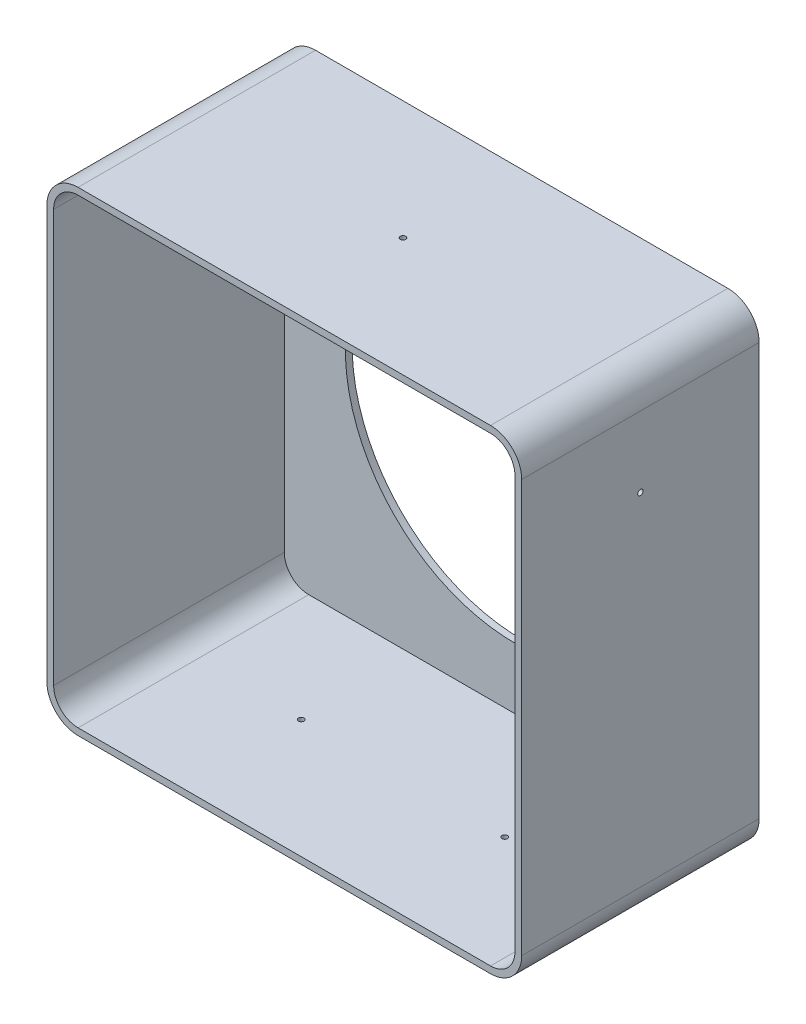
ISO-10303-21;
HEADER;
FILE_DESCRIPTION(('STEP AP214'),'2;1');
FILE_NAME('part.step','',(''),(''),'','','');
FILE_SCHEMA(('AUTOMOTIVE_DESIGN { 1 0 10303 214 1 1 1 1 }'));
ENDSEC;
DATA;
#1=APPLICATION_CONTEXT('core data for automotive mechanical design processes');
#2=APPLICATION_PROTOCOL_DEFINITION('international standard','automotive_design',2000,#1);
#3=PRODUCT_CONTEXT('',#1,'mechanical');
#4=PRODUCT('Part','Part','',(#3));
#5=PRODUCT_RELATED_PRODUCT_CATEGORY('part','',(#4));
#6=PRODUCT_DEFINITION_FORMATION('','',#4);
#7=PRODUCT_DEFINITION_CONTEXT('part definition',#1,'design');
#8=PRODUCT_DEFINITION('design','',#6,#7);
#9=PRODUCT_DEFINITION_SHAPE('','',#8);
#10=(LENGTH_UNIT() NAMED_UNIT(*) SI_UNIT(.MILLI.,.METRE.));
#11=(NAMED_UNIT(*) PLANE_ANGLE_UNIT() SI_UNIT($,.RADIAN.));
#12=(NAMED_UNIT(*) SI_UNIT($,.STERADIAN.) SOLID_ANGLE_UNIT());
#13=UNCERTAINTY_MEASURE_WITH_UNIT(LENGTH_MEASURE(1.E-05),#10,'distance_accuracy_value','');
#14=(GEOMETRIC_REPRESENTATION_CONTEXT(3) GLOBAL_UNCERTAINTY_ASSIGNED_CONTEXT((#13)) GLOBAL_UNIT_ASSIGNED_CONTEXT((#10,
#11,#12)) REPRESENTATION_CONTEXT('',''));
#15=CARTESIAN_POINT('',(0.,0.,0.));
#16=DIRECTION('',(0.,0.,1.));
#17=DIRECTION('',(1.,0.,0.));
#18=AXIS2_PLACEMENT_3D('',#15,#16,#17);
#19=CARTESIAN_POINT('',(0.,0.,35.));
#20=DIRECTION('',(0.,0.,-1.));
#21=DIRECTION('',(-1.,0.,0.));
#22=AXIS2_PLACEMENT_3D('',#19,#20,#21);
#23=CYLINDRICAL_SURFACE('',#22,25.);
#24=CARTESIAN_POINT('',(0.,0.,0.));
#25=DIRECTION('',(0.,0.,1.));
#26=DIRECTION('',(1.,0.,0.));
#27=AXIS2_PLACEMENT_3D('',#24,#25,#26);
#28=CIRCLE('',#27,25.);
#29=CARTESIAN_POINT('',(25.,0.,0.));
#30=VERTEX_POINT('',#29);
#31=EDGE_CURVE('E153',#30,#30,#28,.T.);
#32=ORIENTED_EDGE('',*,*,#31,.F.);
#33=EDGE_LOOP('',(#32));
#34=FACE_BOUND('',#33,.T.);
#35=CARTESIAN_POINT('',(0.,0.,1.));
#36=DIRECTION('',(0.,0.,1.));
#37=DIRECTION('',(1.,0.,0.));
#38=AXIS2_PLACEMENT_3D('',#35,#36,#37);
#39=CIRCLE('',#38,25.);
#40=CARTESIAN_POINT('',(25.,0.,1.));
#41=VERTEX_POINT('',#40);
#42=EDGE_CURVE('E177',#41,#41,#39,.T.);
#43=ORIENTED_EDGE('',*,*,#42,.T.);
#44=EDGE_LOOP('',(#43));
#45=FACE_BOUND('',#44,.T.);
#46=ADVANCED_FACE('F38',(#34,#45),#23,.F.);
#47=CARTESIAN_POINT('',(-30.39566950973,-30.39566950973,35.));
#48=DIRECTION('',(0.,0.,-1.));
#49=DIRECTION('',(-1.,0.,0.));
#50=AXIS2_PLACEMENT_3D('',#47,#48,#49);
#51=PLANE('',#50);
#52=CARTESIAN_POINT('',(-30.39566950973,-30.39566950973,35.));
#53=DIRECTION('',(0.,0.,1.));
#54=DIRECTION('',(1.,0.,0.));
#55=AXIS2_PLACEMENT_3D('',#52,#53,#54);
#56=CIRCLE('',#55,3.60433049026999);
#57=CARTESIAN_POINT('',(-34.,-30.39566950973,35.));
#58=VERTEX_POINT('',#57);
#59=CARTESIAN_POINT('',(-30.39566950973,-34.,35.));
#60=VERTEX_POINT('',#59);
#61=EDGE_CURVE('E239',#58,#60,#56,.T.);
#62=ORIENTED_EDGE('',*,*,#61,.F.);
#63=DIRECTION('',(0.,-1.,0.));
#64=VECTOR('',#63,1.);
#65=CARTESIAN_POINT('',(-34.,30.39566950973,35.));
#66=LINE('',#65,#64);
#67=CARTESIAN_POINT('',(-34.,30.39566950973,35.));
#68=VERTEX_POINT('',#67);
#69=EDGE_CURVE('E55',#68,#58,#66,.T.);
#70=ORIENTED_EDGE('',*,*,#69,.F.);
#71=CARTESIAN_POINT('',(-30.39566950973,30.39566950973,35.));
#72=DIRECTION('',(0.,0.,1.));
#73=DIRECTION('',(1.,0.,0.));
#74=AXIS2_PLACEMENT_3D('',#71,#72,#73);
#75=CIRCLE('',#74,3.60433049027);
#76=CARTESIAN_POINT('',(-30.39566950973,34.,35.));
#77=VERTEX_POINT('',#76);
#78=EDGE_CURVE('E216',#77,#68,#75,.T.);
#79=ORIENTED_EDGE('',*,*,#78,.F.);
#80=DIRECTION('',(-1.,0.,0.));
#81=VECTOR('',#80,1.);
#82=CARTESIAN_POINT('',(30.39566950973,34.,35.));
#83=LINE('',#82,#81);
#84=CARTESIAN_POINT('',(30.39566950973,34.,35.));
#85=VERTEX_POINT('',#84);
#86=EDGE_CURVE('E254',#85,#77,#83,.T.);
#87=ORIENTED_EDGE('',*,*,#86,.F.);
#88=CARTESIAN_POINT('',(30.39566950973,30.39566950973,35.));
#89=DIRECTION('',(0.,0.,1.));
#90=DIRECTION('',(1.,0.,0.));
#91=AXIS2_PLACEMENT_3D('',#88,#89,#90);
#92=CIRCLE('',#91,3.60433049027);
#93=CARTESIAN_POINT('',(34.,30.39566950973,35.));
#94=VERTEX_POINT('',#93);
#95=EDGE_CURVE('E251',#94,#85,#92,.T.);
#96=ORIENTED_EDGE('',*,*,#95,.F.);
#97=DIRECTION('',(0.,1.,0.));
#98=VECTOR('',#97,1.);
#99=CARTESIAN_POINT('',(34.,-30.39566950973,35.));
#100=LINE('',#99,#98);
#101=CARTESIAN_POINT('',(34.,-30.39566950973,35.));
#102=VERTEX_POINT('',#101);
#103=EDGE_CURVE('E248',#102,#94,#100,.T.);
#104=ORIENTED_EDGE('',*,*,#103,.F.);
#105=CARTESIAN_POINT('',(30.39566950973,-30.39566950973,35.));
#106=DIRECTION('',(0.,0.,1.));
#107=DIRECTION('',(1.,0.,0.));
#108=AXIS2_PLACEMENT_3D('',#105,#106,#107);
#109=CIRCLE('',#108,3.60433049026996);
#110=CARTESIAN_POINT('',(30.39566950973,-34.,35.));
#111=VERTEX_POINT('',#110);
#112=EDGE_CURVE('E245',#111,#102,#109,.T.);
#113=ORIENTED_EDGE('',*,*,#112,.F.);
#114=DIRECTION('',(1.,0.,0.));
#115=VECTOR('',#114,1.);
#116=CARTESIAN_POINT('',(-30.39566950973,-34.,35.));
#117=LINE('',#116,#115);
#118=EDGE_CURVE('E242',#60,#111,#117,.T.);
#119=ORIENTED_EDGE('',*,*,#118,.F.);
#120=EDGE_LOOP('',(#62,#70,#79,#87,#96,#104,#113,#119));
#121=FACE_BOUND('',#120,.T.);
#122=CARTESIAN_POINT('',(-30.39566950973,-30.39566950973,35.));
#123=DIRECTION('',(0.,0.,1.));
#124=DIRECTION('',(-1.,0.,0.));
#125=AXIS2_PLACEMENT_3D('',#122,#123,#124);
#126=CIRCLE('',#125,4.60433049026999);
#127=CARTESIAN_POINT('',(-35.,-30.39566950973,35.));
#128=VERTEX_POINT('',#127);
#129=CARTESIAN_POINT('',(-30.39566950973,-35.,35.));
#130=VERTEX_POINT('',#129);
#131=EDGE_CURVE('E165',#128,#130,#126,.T.);
#132=ORIENTED_EDGE('',*,*,#131,.T.);
#133=DIRECTION('',(1.,0.,0.));
#134=VECTOR('',#133,1.);
#135=CARTESIAN_POINT('',(-30.39566950973,-35.,35.));
#136=LINE('',#135,#134);
#137=CARTESIAN_POINT('',(30.39566950973,-35.,35.));
#138=VERTEX_POINT('',#137);
#139=EDGE_CURVE('E105',#130,#138,#136,.T.);
#140=ORIENTED_EDGE('',*,*,#139,.T.);
#141=CARTESIAN_POINT('',(30.39566950973,-30.39566950973,35.));
#142=DIRECTION('',(0.,0.,1.));
#143=DIRECTION('',(-1.,0.,0.));
#144=AXIS2_PLACEMENT_3D('',#141,#142,#143);
#145=CIRCLE('',#144,4.60433049026999);
#146=CARTESIAN_POINT('',(35.,-30.39566950973,35.));
#147=VERTEX_POINT('',#146);
#148=EDGE_CURVE('E283',#138,#147,#145,.T.);
#149=ORIENTED_EDGE('',*,*,#148,.T.);
#150=DIRECTION('',(0.,1.,0.));
#151=VECTOR('',#150,1.);
#152=CARTESIAN_POINT('',(35.,30.39566950973,35.));
#153=LINE('',#152,#151);
#154=CARTESIAN_POINT('',(35.,30.39566950973,35.));
#155=VERTEX_POINT('',#154);
#156=EDGE_CURVE('E285',#147,#155,#153,.T.);
#157=ORIENTED_EDGE('',*,*,#156,.T.);
#158=CARTESIAN_POINT('',(30.39566950973,30.39566950973,35.));
#159=DIRECTION('',(0.,0.,1.));
#160=DIRECTION('',(1.,0.,0.));
#161=AXIS2_PLACEMENT_3D('',#158,#159,#160);
#162=CIRCLE('',#161,4.60433049026998);
#163=CARTESIAN_POINT('',(30.39566950973,35.,35.));
#164=VERTEX_POINT('',#163);
#165=EDGE_CURVE('E128',#155,#164,#162,.T.);
#166=ORIENTED_EDGE('',*,*,#165,.T.);
#167=DIRECTION('',(-1.,0.,0.));
#168=VECTOR('',#167,1.);
#169=CARTESIAN_POINT('',(-30.39566950973,35.,35.));
#170=LINE('',#169,#168);
#171=CARTESIAN_POINT('',(-30.39566950973,35.,35.));
#172=VERTEX_POINT('',#171);
#173=EDGE_CURVE('E121',#164,#172,#170,.T.);
#174=ORIENTED_EDGE('',*,*,#173,.T.);
#175=CARTESIAN_POINT('',(-30.39566950973,30.39566950973,35.));
#176=DIRECTION('',(0.,0.,1.));
#177=DIRECTION('',(1.,0.,0.));
#178=AXIS2_PLACEMENT_3D('',#175,#176,#177);
#179=CIRCLE('',#178,4.60433049027);
#180=CARTESIAN_POINT('',(-35.,30.39566950973,35.));
#181=VERTEX_POINT('',#180);
#182=EDGE_CURVE('E125',#172,#181,#179,.T.);
#183=ORIENTED_EDGE('',*,*,#182,.T.);
#184=DIRECTION('',(0.,-1.,0.));
#185=VECTOR('',#184,1.);
#186=CARTESIAN_POINT('',(-35.,30.39566950973,35.));
#187=LINE('',#186,#185);
#188=EDGE_CURVE('E64',#181,#128,#187,.T.);
#189=ORIENTED_EDGE('',*,*,#188,.T.);
#190=EDGE_LOOP('',(#132,#140,#149,#157,#166,#174,#183,#189));
#191=FACE_BOUND('',#190,.T.);
#192=ADVANCED_FACE('F123',(#121,#191),#51,.F.);
#193=CARTESIAN_POINT('',(-30.39566950973,-30.39566950973,0.));
#194=DIRECTION('',(0.,0.,-1.));
#195=DIRECTION('',(-1.,0.,0.));
#196=AXIS2_PLACEMENT_3D('',#193,#194,#195);
#197=PLANE('',#196);
#198=CARTESIAN_POINT('',(-30.39566950973,-30.39566950973,0.));
#199=DIRECTION('',(0.,0.,1.));
#200=DIRECTION('',(-1.,0.,0.));
#201=AXIS2_PLACEMENT_3D('',#198,#199,#200);
#202=CIRCLE('',#201,4.60433049026999);
#203=CARTESIAN_POINT('',(-35.,-30.39566950973,0.));
#204=VERTEX_POINT('',#203);
#205=CARTESIAN_POINT('',(-30.39566950973,-35.,0.));
#206=VERTEX_POINT('',#205);
#207=EDGE_CURVE('E149',#204,#206,#202,.T.);
#208=ORIENTED_EDGE('',*,*,#207,.F.);
#209=DIRECTION('',(0.,-1.,0.));
#210=VECTOR('',#209,1.);
#211=CARTESIAN_POINT('',(-35.,30.39566950973,0.));
#212=LINE('',#211,#210);
#213=CARTESIAN_POINT('',(-35.,30.39566950973,0.));
#214=VERTEX_POINT('',#213);
#215=EDGE_CURVE('E97',#214,#204,#212,.T.);
#216=ORIENTED_EDGE('',*,*,#215,.F.);
#217=CARTESIAN_POINT('',(-30.39566950973,30.39566950973,0.));
#218=DIRECTION('',(0.,0.,1.));
#219=DIRECTION('',(1.,0.,0.));
#220=AXIS2_PLACEMENT_3D('',#217,#218,#219);
#221=CIRCLE('',#220,4.60433049027);
#222=CARTESIAN_POINT('',(-30.39566950973,35.,0.));
#223=VERTEX_POINT('',#222);
#224=EDGE_CURVE('E162',#223,#214,#221,.T.);
#225=ORIENTED_EDGE('',*,*,#224,.F.);
#226=DIRECTION('',(-1.,0.,0.));
#227=VECTOR('',#226,1.);
#228=CARTESIAN_POINT('',(-30.39566950973,35.,0.));
#229=LINE('',#228,#227);
#230=CARTESIAN_POINT('',(30.39566950973,35.,0.));
#231=VERTEX_POINT('',#230);
#232=EDGE_CURVE('E137',#231,#223,#229,.T.);
#233=ORIENTED_EDGE('',*,*,#232,.F.);
#234=CARTESIAN_POINT('',(30.39566950973,30.39566950973,0.));
#235=DIRECTION('',(0.,0.,1.));
#236=DIRECTION('',(1.,0.,0.));
#237=AXIS2_PLACEMENT_3D('',#234,#235,#236);
#238=CIRCLE('',#237,4.60433049026998);
#239=CARTESIAN_POINT('',(35.,30.39566950973,0.));
#240=VERTEX_POINT('',#239);
#241=EDGE_CURVE('E159',#240,#231,#238,.T.);
#242=ORIENTED_EDGE('',*,*,#241,.F.);
#243=DIRECTION('',(0.,1.,0.));
#244=VECTOR('',#243,1.);
#245=CARTESIAN_POINT('',(35.,30.39566950973,0.));
#246=LINE('',#245,#244);
#247=CARTESIAN_POINT('',(35.,-30.39566950973,0.));
#248=VERTEX_POINT('',#247);
#249=EDGE_CURVE('E157',#248,#240,#246,.T.);
#250=ORIENTED_EDGE('',*,*,#249,.F.);
#251=CARTESIAN_POINT('',(30.39566950973,-30.39566950973,0.));
#252=DIRECTION('',(0.,0.,1.));
#253=DIRECTION('',(-1.,0.,0.));
#254=AXIS2_PLACEMENT_3D('',#251,#252,#253);
#255=CIRCLE('',#254,4.60433049026999);
#256=CARTESIAN_POINT('',(30.39566950973,-35.,0.));
#257=VERTEX_POINT('',#256);
#258=EDGE_CURVE('E155',#257,#248,#255,.T.);
#259=ORIENTED_EDGE('',*,*,#258,.F.);
#260=DIRECTION('',(1.,0.,0.));
#261=VECTOR('',#260,1.);
#262=CARTESIAN_POINT('',(-30.39566950973,-35.,0.));
#263=LINE('',#262,#261);
#264=EDGE_CURVE('E152',#206,#257,#263,.T.);
#265=ORIENTED_EDGE('',*,*,#264,.F.);
#266=EDGE_LOOP('',(#208,#216,#225,#233,#242,#250,#259,#265));
#267=FACE_BOUND('',#266,.T.);
#268=ORIENTED_EDGE('',*,*,#31,.T.);
#269=EDGE_LOOP('',(#268));
#270=FACE_BOUND('',#269,.T.);
#271=ADVANCED_FACE('F298',(#267,#270),#197,.T.);
#272=CARTESIAN_POINT('',(-30.39566950973,-30.39566950973,35.));
#273=DIRECTION('',(0.,0.,-1.));
#274=DIRECTION('',(-1.,0.,0.));
#275=AXIS2_PLACEMENT_3D('',#272,#273,#274);
#276=CYLINDRICAL_SURFACE('',#275,4.60433049026999);
#277=ORIENTED_EDGE('',*,*,#207,.T.);
#278=DIRECTION('',(0.,0.,-1.));
#279=VECTOR('',#278,1.);
#280=CARTESIAN_POINT('',(-30.39566950973,-35.,35.));
#281=LINE('',#280,#279);
#282=EDGE_CURVE('E11',#130,#206,#281,.T.);
#283=ORIENTED_EDGE('',*,*,#282,.F.);
#284=ORIENTED_EDGE('',*,*,#131,.F.);
#285=DIRECTION('',(0.,0.,-1.));
#286=VECTOR('',#285,1.);
#287=CARTESIAN_POINT('',(-35.,-30.39566950973,35.));
#288=LINE('',#287,#286);
#289=EDGE_CURVE('E145',#128,#204,#288,.T.);
#290=ORIENTED_EDGE('',*,*,#289,.T.);
#291=EDGE_LOOP('',(#277,#283,#284,#290));
#292=FACE_BOUND('',#291,.T.);
#293=ADVANCED_FACE('F40',(#292),#276,.T.);
#294=CARTESIAN_POINT('',(-30.39566950973,-35.,35.));
#295=DIRECTION('',(0.,1.,0.));
#296=DIRECTION('',(0.,0.,1.));
#297=AXIS2_PLACEMENT_3D('',#294,#295,#296);
#298=PLANE('',#297);
#299=CARTESIAN_POINT('',(-15.,-35.,17.5));
#300=DIRECTION('',(0.,-1.,0.));
#301=DIRECTION('',(0.,0.,-1.));
#302=AXIS2_PLACEMENT_3D('',#299,#300,#301);
#303=CIRCLE('',#302,0.4);
#304=CARTESIAN_POINT('',(-15.,-35.,17.1));
#305=VERTEX_POINT('',#304);
#306=EDGE_CURVE('E191',#305,#305,#303,.T.);
#307=ORIENTED_EDGE('',*,*,#306,.F.);
#308=EDGE_LOOP('',(#307));
#309=FACE_BOUND('',#308,.T.);
#310=CARTESIAN_POINT('',(15.,-35.,17.5));
#311=DIRECTION('',(0.,-1.,0.));
#312=DIRECTION('',(0.,0.,-1.));
#313=AXIS2_PLACEMENT_3D('',#310,#311,#312);
#314=CIRCLE('',#313,0.4);
#315=CARTESIAN_POINT('',(15.,-35.,17.1));
#316=VERTEX_POINT('',#315);
#317=EDGE_CURVE('E196',#316,#316,#314,.T.);
#318=ORIENTED_EDGE('',*,*,#317,.F.);
#319=EDGE_LOOP('',(#318));
#320=FACE_BOUND('',#319,.T.);
#321=ORIENTED_EDGE('',*,*,#264,.T.);
#322=DIRECTION('',(0.,0.,-1.));
#323=VECTOR('',#322,1.);
#324=CARTESIAN_POINT('',(30.39566950973,-35.,35.));
#325=LINE('',#324,#323);
#326=EDGE_CURVE('E47',#138,#257,#325,.T.);
#327=ORIENTED_EDGE('',*,*,#326,.F.);
#328=ORIENTED_EDGE('',*,*,#139,.F.);
#329=ORIENTED_EDGE('',*,*,#282,.T.);
#330=EDGE_LOOP('',(#321,#327,#328,#329));
#331=FACE_BOUND('',#330,.T.);
#332=ADVANCED_FACE('F304',(#309,#320,#331),#298,.F.);
#333=CARTESIAN_POINT('',(30.39566950973,-30.39566950973,35.));
#334=DIRECTION('',(0.,0.,-1.));
#335=DIRECTION('',(-1.,0.,0.));
#336=AXIS2_PLACEMENT_3D('',#333,#334,#335);
#337=CYLINDRICAL_SURFACE('',#336,4.60433049026999);
#338=ORIENTED_EDGE('',*,*,#258,.T.);
#339=DIRECTION('',(0.,0.,-1.));
#340=VECTOR('',#339,1.);
#341=CARTESIAN_POINT('',(35.,-30.39566950973,35.));
#342=LINE('',#341,#340);
#343=EDGE_CURVE('E172',#147,#248,#342,.T.);
#344=ORIENTED_EDGE('',*,*,#343,.F.);
#345=ORIENTED_EDGE('',*,*,#148,.F.);
#346=ORIENTED_EDGE('',*,*,#326,.T.);
#347=EDGE_LOOP('',(#338,#344,#345,#346));
#348=FACE_BOUND('',#347,.T.);
#349=ADVANCED_FACE('F307',(#348),#337,.T.);
#350=CARTESIAN_POINT('',(35.,30.39566950973,35.));
#351=DIRECTION('',(-1.,0.,0.));
#352=DIRECTION('',(0.,-1.,0.));
#353=AXIS2_PLACEMENT_3D('',#350,#351,#352);
#354=PLANE('',#353);
#355=CARTESIAN_POINT('',(35.,20.,17.5));
#356=DIRECTION('',(1.,0.,0.));
#357=DIRECTION('',(0.,1.,0.));
#358=AXIS2_PLACEMENT_3D('',#355,#356,#357);
#359=CIRCLE('',#358,0.400000000000002);
#360=CARTESIAN_POINT('',(35.,20.4,17.5));
#361=VERTEX_POINT('',#360);
#362=EDGE_CURVE('E185',#361,#361,#359,.T.);
#363=ORIENTED_EDGE('',*,*,#362,.F.);
#364=EDGE_LOOP('',(#363));
#365=FACE_BOUND('',#364,.T.);
#366=ORIENTED_EDGE('',*,*,#249,.T.);
#367=DIRECTION('',(0.,0.,-1.));
#368=VECTOR('',#367,1.);
#369=CARTESIAN_POINT('',(35.,30.39566950973,35.));
#370=LINE('',#369,#368);
#371=EDGE_CURVE('E169',#155,#240,#370,.T.);
#372=ORIENTED_EDGE('',*,*,#371,.F.);
#373=ORIENTED_EDGE('',*,*,#156,.F.);
#374=ORIENTED_EDGE('',*,*,#343,.T.);
#375=EDGE_LOOP('',(#366,#372,#373,#374));
#376=FACE_BOUND('',#375,.T.);
#377=ADVANCED_FACE('F291',(#365,#376),#354,.F.);
#378=CARTESIAN_POINT('',(30.39566950973,30.39566950973,35.));
#379=DIRECTION('',(0.,0.,-1.));
#380=DIRECTION('',(-1.,0.,0.));
#381=AXIS2_PLACEMENT_3D('',#378,#379,#380);
#382=CYLINDRICAL_SURFACE('',#381,4.60433049026998);
#383=ORIENTED_EDGE('',*,*,#241,.T.);
#384=DIRECTION('',(0.,0.,-1.));
#385=VECTOR('',#384,1.);
#386=CARTESIAN_POINT('',(30.39566950973,35.,35.));
#387=LINE('',#386,#385);
#388=EDGE_CURVE('E140',#164,#231,#387,.T.);
#389=ORIENTED_EDGE('',*,*,#388,.F.);
#390=ORIENTED_EDGE('',*,*,#165,.F.);
#391=ORIENTED_EDGE('',*,*,#371,.T.);
#392=EDGE_LOOP('',(#383,#389,#390,#391));
#393=FACE_BOUND('',#392,.T.);
#394=ADVANCED_FACE('F295',(#393),#382,.T.);
#395=CARTESIAN_POINT('',(-30.39566950973,35.,35.));
#396=DIRECTION('',(0.,-1.,0.));
#397=DIRECTION('',(0.,0.,-1.));
#398=AXIS2_PLACEMENT_3D('',#395,#396,#397);
#399=PLANE('',#398);
#400=CARTESIAN_POINT('',(0.,35.,17.5));
#401=DIRECTION('',(0.,1.,0.));
#402=DIRECTION('',(0.,0.,1.));
#403=AXIS2_PLACEMENT_3D('',#400,#401,#402);
#404=CIRCLE('',#403,0.4);
#405=CARTESIAN_POINT('',(0.,35.,17.9));
#406=VERTEX_POINT('',#405);
#407=EDGE_CURVE('E188',#406,#406,#404,.T.);
#408=ORIENTED_EDGE('',*,*,#407,.F.);
#409=EDGE_LOOP('',(#408));
#410=FACE_BOUND('',#409,.T.);
#411=ORIENTED_EDGE('',*,*,#232,.T.);
#412=DIRECTION('',(0.,0.,-1.));
#413=VECTOR('',#412,1.);
#414=CARTESIAN_POINT('',(-30.39566950973,35.,35.));
#415=LINE('',#414,#413);
#416=EDGE_CURVE('E134',#172,#223,#415,.T.);
#417=ORIENTED_EDGE('',*,*,#416,.F.);
#418=ORIENTED_EDGE('',*,*,#173,.F.);
#419=ORIENTED_EDGE('',*,*,#388,.T.);
#420=EDGE_LOOP('',(#411,#417,#418,#419));
#421=FACE_BOUND('',#420,.T.);
#422=ADVANCED_FACE('F135',(#410,#421),#399,.F.);
#423=CARTESIAN_POINT('',(-30.39566950973,30.39566950973,35.));
#424=DIRECTION('',(0.,0.,-1.));
#425=DIRECTION('',(-1.,0.,0.));
#426=AXIS2_PLACEMENT_3D('',#423,#424,#425);
#427=CYLINDRICAL_SURFACE('',#426,4.60433049027);
#428=ORIENTED_EDGE('',*,*,#224,.T.);
#429=DIRECTION('',(0.,0.,-1.));
#430=VECTOR('',#429,1.);
#431=CARTESIAN_POINT('',(-35.,30.39566950973,35.));
#432=LINE('',#431,#430);
#433=EDGE_CURVE('E141',#181,#214,#432,.T.);
#434=ORIENTED_EDGE('',*,*,#433,.F.);
#435=ORIENTED_EDGE('',*,*,#182,.F.);
#436=ORIENTED_EDGE('',*,*,#416,.T.);
#437=EDGE_LOOP('',(#428,#434,#435,#436));
#438=FACE_BOUND('',#437,.T.);
#439=ADVANCED_FACE('F143',(#438),#427,.T.);
#440=CARTESIAN_POINT('',(-35.,30.39566950973,35.));
#441=DIRECTION('',(1.,0.,0.));
#442=DIRECTION('',(0.,1.,0.));
#443=AXIS2_PLACEMENT_3D('',#440,#441,#442);
#444=PLANE('',#443);
#445=CARTESIAN_POINT('',(-35.,20.,17.5));
#446=DIRECTION('',(1.,0.,0.));
#447=DIRECTION('',(0.,1.,0.));
#448=AXIS2_PLACEMENT_3D('',#445,#446,#447);
#449=CIRCLE('',#448,0.400000000000002);
#450=CARTESIAN_POINT('',(-35.,20.4,17.5));
#451=VERTEX_POINT('',#450);
#452=EDGE_CURVE('E209',#451,#451,#449,.T.);
#453=ORIENTED_EDGE('',*,*,#452,.T.);
#454=EDGE_LOOP('',(#453));
#455=FACE_BOUND('',#454,.T.);
#456=ORIENTED_EDGE('',*,*,#215,.T.);
#457=ORIENTED_EDGE('',*,*,#289,.F.);
#458=ORIENTED_EDGE('',*,*,#188,.F.);
#459=ORIENTED_EDGE('',*,*,#433,.T.);
#460=EDGE_LOOP('',(#456,#457,#458,#459));
#461=FACE_BOUND('',#460,.T.);
#462=ADVANCED_FACE('F300',(#455,#461),#444,.F.);
#463=CARTESIAN_POINT('',(-34.,30.39566950973,1.));
#464=DIRECTION('',(-1.,0.,0.));
#465=DIRECTION('',(0.,-1.,0.));
#466=AXIS2_PLACEMENT_3D('',#463,#464,#465);
#467=PLANE('',#466);
#468=CARTESIAN_POINT('',(-34.,20.,17.5));
#469=DIRECTION('',(-1.,0.,0.));
#470=DIRECTION('',(0.,-1.,0.));
#471=AXIS2_PLACEMENT_3D('',#468,#469,#470);
#472=CIRCLE('',#471,0.400000000000002);
#473=CARTESIAN_POINT('',(-34.,19.6,17.5));
#474=VERTEX_POINT('',#473);
#475=EDGE_CURVE('E184',#474,#474,#472,.T.);
#476=ORIENTED_EDGE('',*,*,#475,.T.);
#477=EDGE_LOOP('',(#476));
#478=FACE_BOUND('',#477,.T.);
#479=ORIENTED_EDGE('',*,*,#69,.T.);
#480=DIRECTION('',(0.,0.,1.));
#481=VECTOR('',#480,1.);
#482=CARTESIAN_POINT('',(-34.,-30.39566950973,1.));
#483=LINE('',#482,#481);
#484=CARTESIAN_POINT('',(-34.,-30.39566950973,1.));
#485=VERTEX_POINT('',#484);
#486=EDGE_CURVE('E237',#485,#58,#483,.T.);
#487=ORIENTED_EDGE('',*,*,#486,.F.);
#488=DIRECTION('',(0.,-1.,0.));
#489=VECTOR('',#488,1.);
#490=CARTESIAN_POINT('',(-34.,30.39566950973,1.));
#491=LINE('',#490,#489);
#492=CARTESIAN_POINT('',(-34.,30.39566950973,1.));
#493=VERTEX_POINT('',#492);
#494=EDGE_CURVE('E212',#493,#485,#491,.T.);
#495=ORIENTED_EDGE('',*,*,#494,.F.);
#496=DIRECTION('',(0.,0.,1.));
#497=VECTOR('',#496,1.);
#498=CARTESIAN_POINT('',(-34.,30.39566950973,1.));
#499=LINE('',#498,#497);
#500=EDGE_CURVE('E180',#493,#68,#499,.T.);
#501=ORIENTED_EDGE('',*,*,#500,.T.);
#502=EDGE_LOOP('',(#479,#487,#495,#501));
#503=FACE_BOUND('',#502,.T.);
#504=ADVANCED_FACE('F328',(#478,#503),#467,.F.);
#505=CARTESIAN_POINT('',(-30.39566950973,30.39566950973,1.));
#506=DIRECTION('',(0.,0.,1.));
#507=DIRECTION('',(1.,0.,0.));
#508=AXIS2_PLACEMENT_3D('',#505,#506,#507);
#509=CYLINDRICAL_SURFACE('',#508,3.60433049027);
#510=ORIENTED_EDGE('',*,*,#78,.T.);
#511=ORIENTED_EDGE('',*,*,#500,.F.);
#512=CARTESIAN_POINT('',(-30.39566950973,30.39566950973,1.));
#513=DIRECTION('',(0.,0.,1.));
#514=DIRECTION('',(1.,0.,0.));
#515=AXIS2_PLACEMENT_3D('',#512,#513,#514);
#516=CIRCLE('',#515,3.60433049027);
#517=CARTESIAN_POINT('',(-30.39566950973,34.,1.));
#518=VERTEX_POINT('',#517);
#519=EDGE_CURVE('E234',#518,#493,#516,.T.);
#520=ORIENTED_EDGE('',*,*,#519,.F.);
#521=DIRECTION('',(0.,0.,1.));
#522=VECTOR('',#521,1.);
#523=CARTESIAN_POINT('',(-30.39566950973,34.,1.));
#524=LINE('',#523,#522);
#525=EDGE_CURVE('E260',#518,#77,#524,.T.);
#526=ORIENTED_EDGE('',*,*,#525,.T.);
#527=EDGE_LOOP('',(#510,#511,#520,#526));
#528=FACE_BOUND('',#527,.T.);
#529=ADVANCED_FACE('F366',(#528),#509,.F.);
#530=CARTESIAN_POINT('',(30.39566950973,34.,1.));
#531=DIRECTION('',(0.,1.,0.));
#532=DIRECTION('',(-1.,0.,0.));
#533=AXIS2_PLACEMENT_3D('',#530,#531,#532);
#534=PLANE('',#533);
#535=CARTESIAN_POINT('',(0.,34.,17.5));
#536=DIRECTION('',(0.,1.,0.));
#537=DIRECTION('',(-1.,0.,0.));
#538=AXIS2_PLACEMENT_3D('',#535,#536,#537);
#539=CIRCLE('',#538,0.4);
#540=CARTESIAN_POINT('',(-0.400000000000017,34.,17.5));
#541=VERTEX_POINT('',#540);
#542=EDGE_CURVE('E186',#541,#541,#539,.T.);
#543=ORIENTED_EDGE('',*,*,#542,.T.);
#544=EDGE_LOOP('',(#543));
#545=FACE_BOUND('',#544,.T.);
#546=ORIENTED_EDGE('',*,*,#86,.T.);
#547=ORIENTED_EDGE('',*,*,#525,.F.);
#548=DIRECTION('',(-1.,0.,0.));
#549=VECTOR('',#548,1.);
#550=CARTESIAN_POINT('',(30.39566950973,34.,1.));
#551=LINE('',#550,#549);
#552=CARTESIAN_POINT('',(30.39566950973,34.,1.));
#553=VERTEX_POINT('',#552);
#554=EDGE_CURVE('E231',#553,#518,#551,.T.);
#555=ORIENTED_EDGE('',*,*,#554,.F.);
#556=DIRECTION('',(0.,0.,1.));
#557=VECTOR('',#556,1.);
#558=CARTESIAN_POINT('',(30.39566950973,34.,1.));
#559=LINE('',#558,#557);
#560=EDGE_CURVE('E263',#553,#85,#559,.T.);
#561=ORIENTED_EDGE('',*,*,#560,.T.);
#562=EDGE_LOOP('',(#546,#547,#555,#561));
#563=FACE_BOUND('',#562,.T.);
#564=ADVANCED_FACE('F374',(#545,#563),#534,.F.);
#565=CARTESIAN_POINT('',(30.39566950973,30.39566950973,1.));
#566=DIRECTION('',(0.,0.,1.));
#567=DIRECTION('',(1.,0.,0.));
#568=AXIS2_PLACEMENT_3D('',#565,#566,#567);
#569=CYLINDRICAL_SURFACE('',#568,3.60433049027);
#570=ORIENTED_EDGE('',*,*,#95,.T.);
#571=ORIENTED_EDGE('',*,*,#560,.F.);
#572=CARTESIAN_POINT('',(30.39566950973,30.39566950973,1.));
#573=DIRECTION('',(0.,0.,1.));
#574=DIRECTION('',(1.,0.,0.));
#575=AXIS2_PLACEMENT_3D('',#572,#573,#574);
#576=CIRCLE('',#575,3.60433049027);
#577=CARTESIAN_POINT('',(34.,30.39566950973,1.));
#578=VERTEX_POINT('',#577);
#579=EDGE_CURVE('E228',#578,#553,#576,.T.);
#580=ORIENTED_EDGE('',*,*,#579,.F.);
#581=DIRECTION('',(0.,0.,1.));
#582=VECTOR('',#581,1.);
#583=CARTESIAN_POINT('',(34.,30.39566950973,1.));
#584=LINE('',#583,#582);
#585=EDGE_CURVE('E266',#578,#94,#584,.T.);
#586=ORIENTED_EDGE('',*,*,#585,.T.);
#587=EDGE_LOOP('',(#570,#571,#580,#586));
#588=FACE_BOUND('',#587,.T.);
#589=ADVANCED_FACE('F383',(#588),#569,.F.);
#590=CARTESIAN_POINT('',(34.,-30.39566950973,1.));
#591=DIRECTION('',(1.,0.,0.));
#592=DIRECTION('',(0.,1.,0.));
#593=AXIS2_PLACEMENT_3D('',#590,#591,#592);
#594=PLANE('',#593);
#595=CARTESIAN_POINT('',(34.,20.,17.5));
#596=DIRECTION('',(1.,0.,0.));
#597=DIRECTION('',(0.,1.,0.));
#598=AXIS2_PLACEMENT_3D('',#595,#596,#597);
#599=CIRCLE('',#598,0.400000000000002);
#600=CARTESIAN_POINT('',(34.,20.4,17.5));
#601=VERTEX_POINT('',#600);
#602=EDGE_CURVE('E181',#601,#601,#599,.T.);
#603=ORIENTED_EDGE('',*,*,#602,.T.);
#604=EDGE_LOOP('',(#603));
#605=FACE_BOUND('',#604,.T.);
#606=ORIENTED_EDGE('',*,*,#103,.T.);
#607=ORIENTED_EDGE('',*,*,#585,.F.);
#608=DIRECTION('',(0.,1.,0.));
#609=VECTOR('',#608,1.);
#610=CARTESIAN_POINT('',(34.,-30.39566950973,1.));
#611=LINE('',#610,#609);
#612=CARTESIAN_POINT('',(34.,-30.39566950973,1.));
#613=VERTEX_POINT('',#612);
#614=EDGE_CURVE('E225',#613,#578,#611,.T.);
#615=ORIENTED_EDGE('',*,*,#614,.F.);
#616=DIRECTION('',(0.,0.,1.));
#617=VECTOR('',#616,1.);
#618=CARTESIAN_POINT('',(34.,-30.39566950973,1.));
#619=LINE('',#618,#617);
#620=EDGE_CURVE('E269',#613,#102,#619,.T.);
#621=ORIENTED_EDGE('',*,*,#620,.T.);
#622=EDGE_LOOP('',(#606,#607,#615,#621));
#623=FACE_BOUND('',#622,.T.);
#624=ADVANCED_FACE('F391',(#605,#623),#594,.F.);
#625=CARTESIAN_POINT('',(30.39566950973,-30.39566950973,1.));
#626=DIRECTION('',(0.,0.,1.));
#627=DIRECTION('',(1.,0.,0.));
#628=AXIS2_PLACEMENT_3D('',#625,#626,#627);
#629=CYLINDRICAL_SURFACE('',#628,3.60433049026996);
#630=ORIENTED_EDGE('',*,*,#112,.T.);
#631=ORIENTED_EDGE('',*,*,#620,.F.);
#632=CARTESIAN_POINT('',(30.39566950973,-30.39566950973,1.));
#633=DIRECTION('',(0.,0.,1.));
#634=DIRECTION('',(1.,0.,0.));
#635=AXIS2_PLACEMENT_3D('',#632,#633,#634);
#636=CIRCLE('',#635,3.60433049026996);
#637=CARTESIAN_POINT('',(30.39566950973,-34.,1.));
#638=VERTEX_POINT('',#637);
#639=EDGE_CURVE('E222',#638,#613,#636,.T.);
#640=ORIENTED_EDGE('',*,*,#639,.F.);
#641=DIRECTION('',(0.,0.,1.));
#642=VECTOR('',#641,1.);
#643=CARTESIAN_POINT('',(30.39566950973,-34.,1.));
#644=LINE('',#643,#642);
#645=EDGE_CURVE('E272',#638,#111,#644,.T.);
#646=ORIENTED_EDGE('',*,*,#645,.T.);
#647=EDGE_LOOP('',(#630,#631,#640,#646));
#648=FACE_BOUND('',#647,.T.);
#649=ADVANCED_FACE('F399',(#648),#629,.F.);
#650=CARTESIAN_POINT('',(-30.39566950973,-34.,1.));
#651=DIRECTION('',(0.,-1.,0.));
#652=DIRECTION('',(0.,0.,-1.));
#653=AXIS2_PLACEMENT_3D('',#650,#651,#652);
#654=PLANE('',#653);
#655=CARTESIAN_POINT('',(-15.,-34.,17.5));
#656=DIRECTION('',(0.,-1.,0.));
#657=DIRECTION('',(0.,0.,-1.));
#658=AXIS2_PLACEMENT_3D('',#655,#656,#657);
#659=CIRCLE('',#658,0.4);
#660=CARTESIAN_POINT('',(-15.,-34.,17.1));
#661=VERTEX_POINT('',#660);
#662=EDGE_CURVE('E42',#661,#661,#659,.T.);
#663=ORIENTED_EDGE('',*,*,#662,.T.);
#664=EDGE_LOOP('',(#663));
#665=FACE_BOUND('',#664,.T.);
#666=CARTESIAN_POINT('',(15.,-34.,17.5));
#667=DIRECTION('',(0.,-1.,0.));
#668=DIRECTION('',(0.,0.,-1.));
#669=AXIS2_PLACEMENT_3D('',#666,#667,#668);
#670=CIRCLE('',#669,0.4);
#671=CARTESIAN_POINT('',(15.,-34.,17.1));
#672=VERTEX_POINT('',#671);
#673=EDGE_CURVE('E189',#672,#672,#670,.T.);
#674=ORIENTED_EDGE('',*,*,#673,.T.);
#675=EDGE_LOOP('',(#674));
#676=FACE_BOUND('',#675,.T.);
#677=ORIENTED_EDGE('',*,*,#118,.T.);
#678=ORIENTED_EDGE('',*,*,#645,.F.);
#679=DIRECTION('',(1.,0.,0.));
#680=VECTOR('',#679,1.);
#681=CARTESIAN_POINT('',(-30.39566950973,-34.,1.));
#682=LINE('',#681,#680);
#683=CARTESIAN_POINT('',(-30.39566950973,-34.,1.));
#684=VERTEX_POINT('',#683);
#685=EDGE_CURVE('E219',#684,#638,#682,.T.);
#686=ORIENTED_EDGE('',*,*,#685,.F.);
#687=DIRECTION('',(0.,0.,1.));
#688=VECTOR('',#687,1.);
#689=CARTESIAN_POINT('',(-30.39566950973,-34.,1.));
#690=LINE('',#689,#688);
#691=EDGE_CURVE('E275',#684,#60,#690,.T.);
#692=ORIENTED_EDGE('',*,*,#691,.T.);
#693=EDGE_LOOP('',(#677,#678,#686,#692));
#694=FACE_BOUND('',#693,.T.);
#695=ADVANCED_FACE('F407',(#665,#676,#694),#654,.F.);
#696=CARTESIAN_POINT('',(-30.39566950973,-30.39566950973,1.));
#697=DIRECTION('',(0.,0.,1.));
#698=DIRECTION('',(1.,0.,0.));
#699=AXIS2_PLACEMENT_3D('',#696,#697,#698);
#700=CYLINDRICAL_SURFACE('',#699,3.60433049026999);
#701=ORIENTED_EDGE('',*,*,#61,.T.);
#702=ORIENTED_EDGE('',*,*,#691,.F.);
#703=CARTESIAN_POINT('',(-30.39566950973,-30.39566950973,1.));
#704=DIRECTION('',(0.,0.,1.));
#705=DIRECTION('',(1.,0.,0.));
#706=AXIS2_PLACEMENT_3D('',#703,#704,#705);
#707=CIRCLE('',#706,3.60433049026999);
#708=EDGE_CURVE('E215',#485,#684,#707,.T.);
#709=ORIENTED_EDGE('',*,*,#708,.F.);
#710=ORIENTED_EDGE('',*,*,#486,.T.);
#711=EDGE_LOOP('',(#701,#702,#709,#710));
#712=FACE_BOUND('',#711,.T.);
#713=ADVANCED_FACE('F416',(#712),#700,.F.);
#714=CARTESIAN_POINT('',(-30.39566950973,-30.39566950973,1.));
#715=DIRECTION('',(0.,0.,1.));
#716=DIRECTION('',(1.,0.,0.));
#717=AXIS2_PLACEMENT_3D('',#714,#715,#716);
#718=PLANE('',#717);
#719=ORIENTED_EDGE('',*,*,#42,.F.);
#720=EDGE_LOOP('',(#719));
#721=FACE_BOUND('',#720,.T.);
#722=ORIENTED_EDGE('',*,*,#494,.T.);
#723=ORIENTED_EDGE('',*,*,#708,.T.);
#724=ORIENTED_EDGE('',*,*,#685,.T.);
#725=ORIENTED_EDGE('',*,*,#639,.T.);
#726=ORIENTED_EDGE('',*,*,#614,.T.);
#727=ORIENTED_EDGE('',*,*,#579,.T.);
#728=ORIENTED_EDGE('',*,*,#554,.T.);
#729=ORIENTED_EDGE('',*,*,#519,.T.);
#730=EDGE_LOOP('',(#722,#723,#724,#725,#726,#727,#728,#729));
#731=FACE_BOUND('',#730,.T.);
#732=ADVANCED_FACE('F425',(#721,#731),#718,.T.);
#733=CARTESIAN_POINT('',(-43.,20.,17.5));
#734=DIRECTION('',(1.,0.,0.));
#735=DIRECTION('',(0.,1.,0.));
#736=AXIS2_PLACEMENT_3D('',#733,#734,#735);
#737=CYLINDRICAL_SURFACE('',#736,0.400000000000002);
#738=ORIENTED_EDGE('',*,*,#362,.T.);
#739=EDGE_LOOP('',(#738));
#740=FACE_BOUND('',#739,.T.);
#741=ORIENTED_EDGE('',*,*,#602,.F.);
#742=EDGE_LOOP('',(#741));
#743=FACE_BOUND('',#742,.T.);
#744=ADVANCED_FACE('F432',(#740,#743),#737,.F.);
#745=ORIENTED_EDGE('',*,*,#475,.F.);
#746=EDGE_LOOP('',(#745));
#747=FACE_BOUND('',#746,.T.);
#748=ORIENTED_EDGE('',*,*,#452,.F.);
#749=EDGE_LOOP('',(#748));
#750=FACE_BOUND('',#749,.T.);
#751=ADVANCED_FACE('F439',(#747,#750),#737,.F.);
#752=CARTESIAN_POINT('',(0.,13.,17.5));
#753=DIRECTION('',(0.,1.,0.));
#754=DIRECTION('',(0.,0.,1.));
#755=AXIS2_PLACEMENT_3D('',#752,#753,#754);
#756=CYLINDRICAL_SURFACE('',#755,0.4);
#757=ORIENTED_EDGE('',*,*,#407,.T.);
#758=EDGE_LOOP('',(#757));
#759=FACE_BOUND('',#758,.T.);
#760=ORIENTED_EDGE('',*,*,#542,.F.);
#761=EDGE_LOOP('',(#760));
#762=FACE_BOUND('',#761,.T.);
#763=ADVANCED_FACE('F446',(#759,#762),#756,.F.);
#764=CARTESIAN_POINT('',(15.,-25.,17.5));
#765=DIRECTION('',(0.,-1.,0.));
#766=DIRECTION('',(0.,0.,-1.));
#767=AXIS2_PLACEMENT_3D('',#764,#765,#766);
#768=CYLINDRICAL_SURFACE('',#767,0.4);
#769=ORIENTED_EDGE('',*,*,#317,.T.);
#770=EDGE_LOOP('',(#769));
#771=FACE_BOUND('',#770,.T.);
#772=ORIENTED_EDGE('',*,*,#673,.F.);
#773=EDGE_LOOP('',(#772));
#774=FACE_BOUND('',#773,.T.);
#775=ADVANCED_FACE('F452',(#771,#774),#768,.F.);
#776=CARTESIAN_POINT('',(-15.,-25.,17.5));
#777=DIRECTION('',(0.,-1.,0.));
#778=DIRECTION('',(0.,0.,-1.));
#779=AXIS2_PLACEMENT_3D('',#776,#777,#778);
#780=CYLINDRICAL_SURFACE('',#779,0.4);
#781=ORIENTED_EDGE('',*,*,#306,.T.);
#782=EDGE_LOOP('',(#781));
#783=FACE_BOUND('',#782,.T.);
#784=ORIENTED_EDGE('',*,*,#662,.F.);
#785=EDGE_LOOP('',(#784));
#786=FACE_BOUND('',#785,.T.);
#787=ADVANCED_FACE('F459',(#783,#786),#780,.F.);
#788=CLOSED_SHELL('',(#46,#192,#271,#293,#332,#349,#377,#394,#422,#439,#462,#504,#529,#564,#589,
#624,#649,#695,#713,#732,#744,#751,#763,#775,#787));
#789=MANIFOLD_SOLID_BREP('B2',#788);
#790=ADVANCED_BREP_SHAPE_REPRESENTATION('',(#18,#789),#14);
#791=SHAPE_DEFINITION_REPRESENTATION(#9,#790);
ENDSEC;
END-ISO-10303-21;
